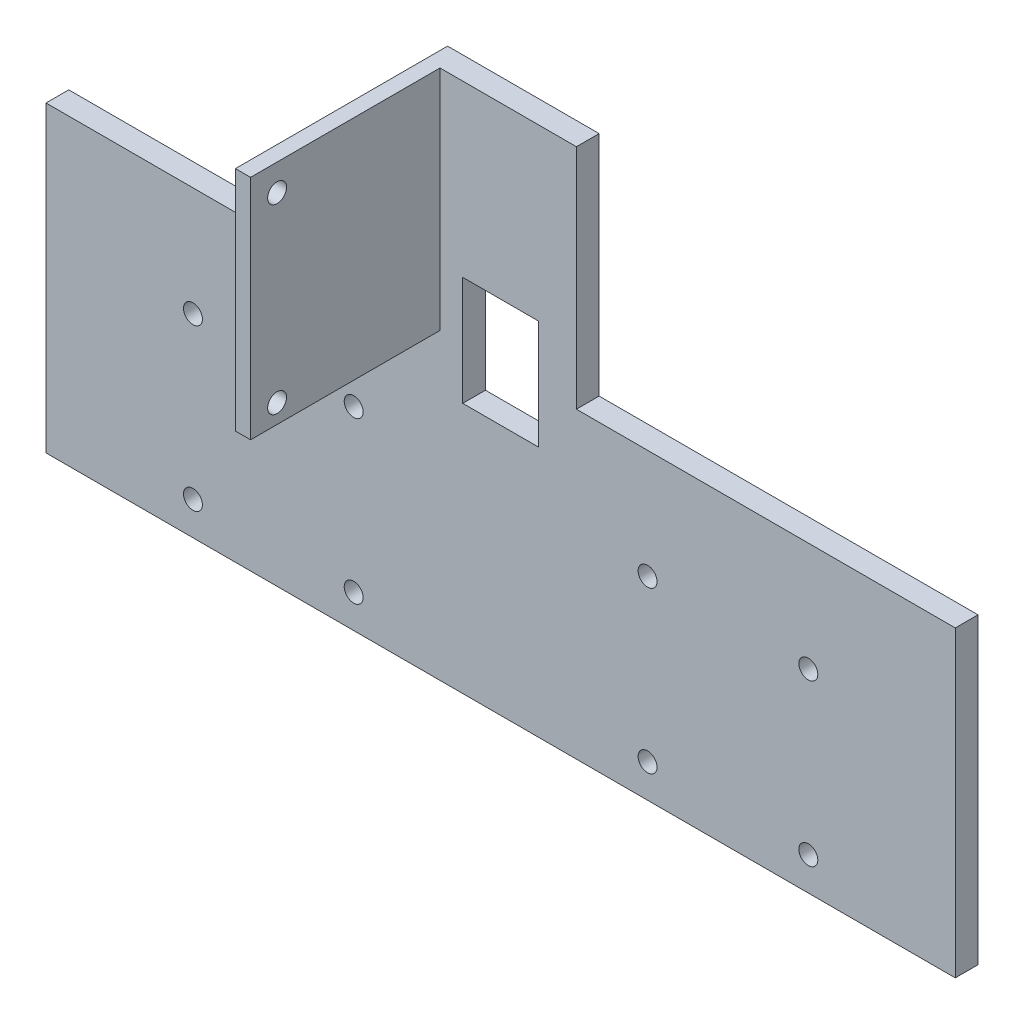
ISO-10303-21;
HEADER;
FILE_DESCRIPTION(('STEP AP214'),'2;1');
FILE_NAME('part.step','',(''),(''),'','','');
FILE_SCHEMA(('AUTOMOTIVE_DESIGN { 1 0 10303 214 1 1 1 1 }'));
ENDSEC;
DATA;
#1=APPLICATION_CONTEXT('core data for automotive mechanical design processes');
#2=APPLICATION_PROTOCOL_DEFINITION('international standard','automotive_design',2000,#1);
#3=PRODUCT_CONTEXT('',#1,'mechanical');
#4=PRODUCT('Part','Part','',(#3));
#5=PRODUCT_RELATED_PRODUCT_CATEGORY('part','',(#4));
#6=PRODUCT_DEFINITION_FORMATION('','',#4);
#7=PRODUCT_DEFINITION_CONTEXT('part definition',#1,'design');
#8=PRODUCT_DEFINITION('design','',#6,#7);
#9=PRODUCT_DEFINITION_SHAPE('','',#8);
#10=(LENGTH_UNIT() NAMED_UNIT(*) SI_UNIT(.MILLI.,.METRE.));
#11=(NAMED_UNIT(*) PLANE_ANGLE_UNIT() SI_UNIT($,.RADIAN.));
#12=(NAMED_UNIT(*) SI_UNIT($,.STERADIAN.) SOLID_ANGLE_UNIT());
#13=UNCERTAINTY_MEASURE_WITH_UNIT(LENGTH_MEASURE(1.E-05),#10,'distance_accuracy_value','');
#14=(GEOMETRIC_REPRESENTATION_CONTEXT(3) GLOBAL_UNCERTAINTY_ASSIGNED_CONTEXT((#13)) GLOBAL_UNIT_ASSIGNED_CONTEXT((#10,
#11,#12)) REPRESENTATION_CONTEXT('',''));
#15=CARTESIAN_POINT('',(0.,0.,0.));
#16=DIRECTION('',(0.,0.,1.));
#17=DIRECTION('',(1.,0.,0.));
#18=AXIS2_PLACEMENT_3D('',#15,#16,#17);
#19=CARTESIAN_POINT('',(-10.,20.,3.));
#20=DIRECTION('',(1.,0.,0.));
#21=DIRECTION('',(0.,0.,-1.));
#22=AXIS2_PLACEMENT_3D('',#19,#20,#21);
#23=PLANE('',#22);
#24=DIRECTION('',(0.,-1.,0.));
#25=VECTOR('',#24,1.);
#26=CARTESIAN_POINT('',(-10.,20.,0.));
#27=LINE('',#26,#25);
#28=CARTESIAN_POINT('',(-10.,50.,0.));
#29=VERTEX_POINT('',#28);
#30=CARTESIAN_POINT('',(-10.,20.,0.));
#31=VERTEX_POINT('',#30);
#32=EDGE_CURVE('E230',#29,#31,#27,.T.);
#33=ORIENTED_EDGE('',*,*,#32,.T.);
#34=DIRECTION('',(0.,0.,-1.));
#35=VECTOR('',#34,1.);
#36=CARTESIAN_POINT('',(-10.,20.,3.));
#37=LINE('',#36,#35);
#38=CARTESIAN_POINT('',(-10.,20.,3.));
#39=VERTEX_POINT('',#38);
#40=EDGE_CURVE('E245',#39,#31,#37,.T.);
#41=ORIENTED_EDGE('',*,*,#40,.F.);
#42=DIRECTION('',(0.,0.,-1.));
#43=VECTOR('',#42,1.);
#44=CARTESIAN_POINT('',(-10.,20.,28.));
#45=LINE('',#44,#43);
#46=CARTESIAN_POINT('',(-10.,20.,28.));
#47=VERTEX_POINT('',#46);
#48=EDGE_CURVE('E201',#47,#39,#45,.T.);
#49=ORIENTED_EDGE('',*,*,#48,.F.);
#50=DIRECTION('',(0.,-1.,0.));
#51=VECTOR('',#50,1.);
#52=CARTESIAN_POINT('',(-10.,50.,28.));
#53=LINE('',#52,#51);
#54=CARTESIAN_POINT('',(-10.,50.,28.));
#55=VERTEX_POINT('',#54);
#56=EDGE_CURVE('E180',#55,#47,#53,.T.);
#57=ORIENTED_EDGE('',*,*,#56,.F.);
#58=DIRECTION('',(0.,0.,-1.));
#59=VECTOR('',#58,1.);
#60=CARTESIAN_POINT('',(-10.,50.,3.));
#61=LINE('',#60,#59);
#62=EDGE_CURVE('E248',#55,#29,#61,.T.);
#63=ORIENTED_EDGE('',*,*,#62,.T.);
#64=EDGE_LOOP('',(#33,#41,#49,#57,#63));
#65=FACE_BOUND('',#64,.T.);
#66=CARTESIAN_POINT('',(-10.,22.499999999999,24.4999999999948));
#67=DIRECTION('',(-1.,0.,0.));
#68=DIRECTION('',(0.,0.,1.));
#69=AXIS2_PLACEMENT_3D('',#66,#67,#68);
#70=CIRCLE('',#69,1.24999999999999);
#71=CARTESIAN_POINT('',(-10.,22.499999999999,25.7499999999947));
#72=VERTEX_POINT('',#71);
#73=EDGE_CURVE('E379',#72,#72,#70,.T.);
#74=ORIENTED_EDGE('',*,*,#73,.F.);
#75=EDGE_LOOP('',(#74));
#76=FACE_BOUND('',#75,.T.);
#77=CARTESIAN_POINT('',(-10.,46.499999999999,24.499999999995));
#78=DIRECTION('',(-1.,0.,0.));
#79=DIRECTION('',(0.,0.,1.));
#80=AXIS2_PLACEMENT_3D('',#77,#78,#79);
#81=CIRCLE('',#80,1.24999999999999);
#82=CARTESIAN_POINT('',(-10.,46.499999999999,25.749999999995));
#83=VERTEX_POINT('',#82);
#84=EDGE_CURVE('E387',#83,#83,#81,.T.);
#85=ORIENTED_EDGE('',*,*,#84,.F.);
#86=EDGE_LOOP('',(#85));
#87=FACE_BOUND('',#86,.T.);
#88=ADVANCED_FACE('F39',(#65,#76,#87),#23,.F.);
#89=CARTESIAN_POINT('',(60.,20.,3.));
#90=DIRECTION('',(-1.,0.,0.));
#91=DIRECTION('',(0.,0.,1.));
#92=AXIS2_PLACEMENT_3D('',#89,#90,#91);
#93=PLANE('',#92);
#94=DIRECTION('',(0.,1.,0.));
#95=VECTOR('',#94,1.);
#96=CARTESIAN_POINT('',(60.,20.,0.));
#97=LINE('',#96,#95);
#98=CARTESIAN_POINT('',(60.,-20.,0.));
#99=VERTEX_POINT('',#98);
#100=CARTESIAN_POINT('',(60.,20.,0.));
#101=VERTEX_POINT('',#100);
#102=EDGE_CURVE('E204',#99,#101,#97,.T.);
#103=ORIENTED_EDGE('',*,*,#102,.T.);
#104=DIRECTION('',(0.,0.,-1.));
#105=VECTOR('',#104,1.);
#106=CARTESIAN_POINT('',(60.,20.,3.));
#107=LINE('',#106,#105);
#108=CARTESIAN_POINT('',(60.,20.,3.));
#109=VERTEX_POINT('',#108);
#110=EDGE_CURVE('E11',#109,#101,#107,.T.);
#111=ORIENTED_EDGE('',*,*,#110,.F.);
#112=DIRECTION('',(0.,1.,0.));
#113=VECTOR('',#112,1.);
#114=CARTESIAN_POINT('',(60.,20.,3.));
#115=LINE('',#114,#113);
#116=CARTESIAN_POINT('',(60.,-20.,3.));
#117=VERTEX_POINT('',#116);
#118=EDGE_CURVE('E205',#117,#109,#115,.T.);
#119=ORIENTED_EDGE('',*,*,#118,.F.);
#120=DIRECTION('',(0.,0.,-1.));
#121=VECTOR('',#120,1.);
#122=CARTESIAN_POINT('',(60.,-20.,3.));
#123=LINE('',#122,#121);
#124=EDGE_CURVE('E221',#117,#99,#123,.T.);
#125=ORIENTED_EDGE('',*,*,#124,.T.);
#126=EDGE_LOOP('',(#103,#111,#119,#125));
#127=FACE_BOUND('',#126,.T.);
#128=ADVANCED_FACE('F41',(#127),#93,.F.);
#129=CARTESIAN_POINT('',(60.,20.,3.));
#130=DIRECTION('',(0.,-1.,0.));
#131=DIRECTION('',(1.,0.,0.));
#132=AXIS2_PLACEMENT_3D('',#129,#130,#131);
#133=PLANE('',#132);
#134=DIRECTION('',(-1.,0.,0.));
#135=VECTOR('',#134,1.);
#136=CARTESIAN_POINT('',(60.,20.,0.));
#137=LINE('',#136,#135);
#138=CARTESIAN_POINT('',(10.,20.,0.));
#139=VERTEX_POINT('',#138);
#140=EDGE_CURVE('E224',#101,#139,#137,.T.);
#141=ORIENTED_EDGE('',*,*,#140,.T.);
#142=DIRECTION('',(0.,0.,-1.));
#143=VECTOR('',#142,1.);
#144=CARTESIAN_POINT('',(10.,20.,3.));
#145=LINE('',#144,#143);
#146=CARTESIAN_POINT('',(10.,20.,3.));
#147=VERTEX_POINT('',#146);
#148=EDGE_CURVE('E47',#147,#139,#145,.T.);
#149=ORIENTED_EDGE('',*,*,#148,.F.);
#150=DIRECTION('',(-1.,0.,0.));
#151=VECTOR('',#150,1.);
#152=CARTESIAN_POINT('',(60.,20.,3.));
#153=LINE('',#152,#151);
#154=EDGE_CURVE('E208',#109,#147,#153,.T.);
#155=ORIENTED_EDGE('',*,*,#154,.F.);
#156=ORIENTED_EDGE('',*,*,#110,.T.);
#157=EDGE_LOOP('',(#141,#149,#155,#156));
#158=FACE_BOUND('',#157,.T.);
#159=ADVANCED_FACE('F301',(#158),#133,.F.);
#160=CARTESIAN_POINT('',(9.99999999999999,50.,3.));
#161=DIRECTION('',(-1.,0.,0.));
#162=DIRECTION('',(0.,-1.,0.));
#163=AXIS2_PLACEMENT_3D('',#160,#161,#162);
#164=PLANE('',#163);
#165=DIRECTION('',(0.,1.,0.));
#166=VECTOR('',#165,1.);
#167=CARTESIAN_POINT('',(9.99999999999999,50.,0.));
#168=LINE('',#167,#166);
#169=CARTESIAN_POINT('',(9.99999999999999,50.,0.));
#170=VERTEX_POINT('',#169);
#171=EDGE_CURVE('E226',#139,#170,#168,.T.);
#172=ORIENTED_EDGE('',*,*,#171,.T.);
#173=DIRECTION('',(0.,0.,-1.));
#174=VECTOR('',#173,1.);
#175=CARTESIAN_POINT('',(9.99999999999999,50.,3.));
#176=LINE('',#175,#174);
#177=CARTESIAN_POINT('',(9.99999999999999,50.,3.));
#178=VERTEX_POINT('',#177);
#179=EDGE_CURVE('E251',#178,#170,#176,.T.);
#180=ORIENTED_EDGE('',*,*,#179,.F.);
#181=DIRECTION('',(0.,1.,0.));
#182=VECTOR('',#181,1.);
#183=CARTESIAN_POINT('',(9.99999999999999,50.,3.));
#184=LINE('',#183,#182);
#185=EDGE_CURVE('E211',#147,#178,#184,.T.);
#186=ORIENTED_EDGE('',*,*,#185,.F.);
#187=ORIENTED_EDGE('',*,*,#148,.T.);
#188=EDGE_LOOP('',(#172,#180,#186,#187));
#189=FACE_BOUND('',#188,.T.);
#190=ADVANCED_FACE('F258',(#189),#164,.F.);
#191=CARTESIAN_POINT('',(-10.,50.,3.));
#192=DIRECTION('',(0.,-1.,0.));
#193=DIRECTION('',(0.,0.,-1.));
#194=AXIS2_PLACEMENT_3D('',#191,#192,#193);
#195=PLANE('',#194);
#196=DIRECTION('',(-1.,0.,0.));
#197=VECTOR('',#196,1.);
#198=CARTESIAN_POINT('',(-10.,50.,0.));
#199=LINE('',#198,#197);
#200=EDGE_CURVE('E228',#170,#29,#199,.T.);
#201=ORIENTED_EDGE('',*,*,#200,.T.);
#202=ORIENTED_EDGE('',*,*,#62,.F.);
#203=DIRECTION('',(-1.,0.,0.));
#204=VECTOR('',#203,1.);
#205=CARTESIAN_POINT('',(-10.,50.,28.));
#206=LINE('',#205,#204);
#207=CARTESIAN_POINT('',(-8.00000000000001,50.,28.));
#208=VERTEX_POINT('',#207);
#209=EDGE_CURVE('E188',#208,#55,#206,.T.);
#210=ORIENTED_EDGE('',*,*,#209,.F.);
#211=DIRECTION('',(0.,0.,-1.));
#212=VECTOR('',#211,1.);
#213=CARTESIAN_POINT('',(-8.00000000000001,50.,28.));
#214=LINE('',#213,#212);
#215=CARTESIAN_POINT('',(-8.,50.,3.));
#216=VERTEX_POINT('',#215);
#217=EDGE_CURVE('E191',#208,#216,#214,.T.);
#218=ORIENTED_EDGE('',*,*,#217,.T.);
#219=DIRECTION('',(-1.,0.,0.));
#220=VECTOR('',#219,1.);
#221=CARTESIAN_POINT('',(-10.,50.,3.));
#222=LINE('',#221,#220);
#223=EDGE_CURVE('E213',#178,#216,#222,.T.);
#224=ORIENTED_EDGE('',*,*,#223,.F.);
#225=ORIENTED_EDGE('',*,*,#179,.T.);
#226=EDGE_LOOP('',(#201,#202,#210,#218,#224,#225));
#227=FACE_BOUND('',#226,.T.);
#228=ADVANCED_FACE('F266',(#227),#195,.F.);
#229=CARTESIAN_POINT('',(-60.,20.,3.));
#230=DIRECTION('',(0.,-1.,0.));
#231=DIRECTION('',(0.,0.,-1.));
#232=AXIS2_PLACEMENT_3D('',#229,#230,#231);
#233=PLANE('',#232);
#234=DIRECTION('',(-1.,0.,0.));
#235=VECTOR('',#234,1.);
#236=CARTESIAN_POINT('',(-60.,20.,0.));
#237=LINE('',#236,#235);
#238=CARTESIAN_POINT('',(-60.,20.,0.));
#239=VERTEX_POINT('',#238);
#240=EDGE_CURVE('E232',#31,#239,#237,.T.);
#241=ORIENTED_EDGE('',*,*,#240,.T.);
#242=DIRECTION('',(0.,0.,-1.));
#243=VECTOR('',#242,1.);
#244=CARTESIAN_POINT('',(-60.,20.,3.));
#245=LINE('',#244,#243);
#246=CARTESIAN_POINT('',(-60.,20.,3.));
#247=VERTEX_POINT('',#246);
#248=EDGE_CURVE('E242',#247,#239,#245,.T.);
#249=ORIENTED_EDGE('',*,*,#248,.F.);
#250=DIRECTION('',(-1.,0.,0.));
#251=VECTOR('',#250,1.);
#252=CARTESIAN_POINT('',(-60.,20.,3.));
#253=LINE('',#252,#251);
#254=EDGE_CURVE('E215',#39,#247,#253,.T.);
#255=ORIENTED_EDGE('',*,*,#254,.F.);
#256=ORIENTED_EDGE('',*,*,#40,.T.);
#257=EDGE_LOOP('',(#241,#249,#255,#256));
#258=FACE_BOUND('',#257,.T.);
#259=ADVANCED_FACE('F305',(#258),#233,.F.);
#260=CARTESIAN_POINT('',(-60.,20.,3.));
#261=DIRECTION('',(1.,0.,0.));
#262=DIRECTION('',(0.,1.,0.));
#263=AXIS2_PLACEMENT_3D('',#260,#261,#262);
#264=PLANE('',#263);
#265=DIRECTION('',(0.,-1.,0.));
#266=VECTOR('',#265,1.);
#267=CARTESIAN_POINT('',(-60.,20.,0.));
#268=LINE('',#267,#266);
#269=CARTESIAN_POINT('',(-60.,-20.,0.));
#270=VERTEX_POINT('',#269);
#271=EDGE_CURVE('E234',#239,#270,#268,.T.);
#272=ORIENTED_EDGE('',*,*,#271,.T.);
#273=DIRECTION('',(0.,0.,-1.));
#274=VECTOR('',#273,1.);
#275=CARTESIAN_POINT('',(-60.,-20.,3.));
#276=LINE('',#275,#274);
#277=CARTESIAN_POINT('',(-60.,-20.,3.));
#278=VERTEX_POINT('',#277);
#279=EDGE_CURVE('E239',#278,#270,#276,.T.);
#280=ORIENTED_EDGE('',*,*,#279,.F.);
#281=DIRECTION('',(0.,-1.,0.));
#282=VECTOR('',#281,1.);
#283=CARTESIAN_POINT('',(-60.,20.,3.));
#284=LINE('',#283,#282);
#285=EDGE_CURVE('E217',#247,#278,#284,.T.);
#286=ORIENTED_EDGE('',*,*,#285,.F.);
#287=ORIENTED_EDGE('',*,*,#248,.T.);
#288=EDGE_LOOP('',(#272,#280,#286,#287));
#289=FACE_BOUND('',#288,.T.);
#290=ADVANCED_FACE('F324',(#289),#264,.F.);
#291=CARTESIAN_POINT('',(-60.,-20.,3.));
#292=DIRECTION('',(0.,1.,0.));
#293=DIRECTION('',(-1.,0.,0.));
#294=AXIS2_PLACEMENT_3D('',#291,#292,#293);
#295=PLANE('',#294);
#296=DIRECTION('',(1.,0.,0.));
#297=VECTOR('',#296,1.);
#298=CARTESIAN_POINT('',(-60.,-20.,0.));
#299=LINE('',#298,#297);
#300=EDGE_CURVE('E209',#270,#99,#299,.T.);
#301=ORIENTED_EDGE('',*,*,#300,.T.);
#302=ORIENTED_EDGE('',*,*,#124,.F.);
#303=DIRECTION('',(1.,0.,0.));
#304=VECTOR('',#303,1.);
#305=CARTESIAN_POINT('',(-60.,-20.,3.));
#306=LINE('',#305,#304);
#307=EDGE_CURVE('E219',#278,#117,#306,.T.);
#308=ORIENTED_EDGE('',*,*,#307,.F.);
#309=ORIENTED_EDGE('',*,*,#279,.T.);
#310=EDGE_LOOP('',(#301,#302,#308,#309));
#311=FACE_BOUND('',#310,.T.);
#312=ADVANCED_FACE('F319',(#311),#295,.F.);
#313=CARTESIAN_POINT('',(0.,0.,3.));
#314=DIRECTION('',(0.,0.,1.));
#315=DIRECTION('',(1.,0.,0.));
#316=AXIS2_PLACEMENT_3D('',#313,#314,#315);
#317=PLANE('',#316);
#318=CARTESIAN_POINT('',(-40.6066017177982,5.60660171779826,3.));
#319=DIRECTION('',(0.,0.,1.));
#320=DIRECTION('',(1.,0.,0.));
#321=AXIS2_PLACEMENT_3D('',#318,#319,#320);
#322=CIRCLE('',#321,1.24999999999999);
#323=CARTESIAN_POINT('',(-39.3566017177982,5.60660171779826,3.));
#324=VERTEX_POINT('',#323);
#325=EDGE_CURVE('E343',#324,#324,#322,.T.);
#326=ORIENTED_EDGE('',*,*,#325,.F.);
#327=EDGE_LOOP('',(#326));
#328=FACE_BOUND('',#327,.T.);
#329=CARTESIAN_POINT('',(-19.3933982822018,5.60660171779824,3.));
#330=DIRECTION('',(0.,0.,1.));
#331=DIRECTION('',(1.,0.,0.));
#332=AXIS2_PLACEMENT_3D('',#329,#330,#331);
#333=CIRCLE('',#332,1.24999999999999);
#334=CARTESIAN_POINT('',(-18.1433982822018,5.60660171779824,3.));
#335=VERTEX_POINT('',#334);
#336=EDGE_CURVE('E347',#335,#335,#333,.T.);
#337=ORIENTED_EDGE('',*,*,#336,.F.);
#338=EDGE_LOOP('',(#337));
#339=FACE_BOUND('',#338,.T.);
#340=CARTESIAN_POINT('',(-19.3933982822018,-15.6066017177982,3.));
#341=DIRECTION('',(0.,0.,1.));
#342=DIRECTION('',(1.,0.,0.));
#343=AXIS2_PLACEMENT_3D('',#340,#341,#342);
#344=CIRCLE('',#343,1.24999999999999);
#345=CARTESIAN_POINT('',(-18.1433982822018,-15.6066017177982,3.));
#346=VERTEX_POINT('',#345);
#347=EDGE_CURVE('E351',#346,#346,#344,.T.);
#348=ORIENTED_EDGE('',*,*,#347,.F.);
#349=EDGE_LOOP('',(#348));
#350=FACE_BOUND('',#349,.T.);
#351=CARTESIAN_POINT('',(-40.6066017177982,-15.6066017177981,3.));
#352=DIRECTION('',(0.,0.,1.));
#353=DIRECTION('',(1.,0.,0.));
#354=AXIS2_PLACEMENT_3D('',#351,#352,#353);
#355=CIRCLE('',#354,1.24999999999999);
#356=CARTESIAN_POINT('',(-39.3566017177983,-15.6066017177981,3.));
#357=VERTEX_POINT('',#356);
#358=EDGE_CURVE('E355',#357,#357,#355,.T.);
#359=ORIENTED_EDGE('',*,*,#358,.F.);
#360=EDGE_LOOP('',(#359));
#361=FACE_BOUND('',#360,.T.);
#362=CARTESIAN_POINT('',(19.3933982822018,5.60660171779821,3.));
#363=DIRECTION('',(0.,0.,1.));
#364=DIRECTION('',(1.,0.,0.));
#365=AXIS2_PLACEMENT_3D('',#362,#363,#364);
#366=CIRCLE('',#365,1.24999999999999);
#367=CARTESIAN_POINT('',(20.6433982822018,5.60660171779821,3.));
#368=VERTEX_POINT('',#367);
#369=EDGE_CURVE('E359',#368,#368,#366,.T.);
#370=ORIENTED_EDGE('',*,*,#369,.F.);
#371=EDGE_LOOP('',(#370));
#372=FACE_BOUND('',#371,.T.);
#373=CARTESIAN_POINT('',(40.6066017177982,5.6066017177982,3.));
#374=DIRECTION('',(0.,0.,1.));
#375=DIRECTION('',(1.,0.,0.));
#376=AXIS2_PLACEMENT_3D('',#373,#374,#375);
#377=CIRCLE('',#376,1.24999999999999);
#378=CARTESIAN_POINT('',(41.8566017177982,5.6066017177982,3.));
#379=VERTEX_POINT('',#378);
#380=EDGE_CURVE('E363',#379,#379,#377,.T.);
#381=ORIENTED_EDGE('',*,*,#380,.F.);
#382=EDGE_LOOP('',(#381));
#383=FACE_BOUND('',#382,.T.);
#384=CARTESIAN_POINT('',(19.3933982822018,-15.6066017177982,3.));
#385=DIRECTION('',(0.,0.,1.));
#386=DIRECTION('',(1.,0.,0.));
#387=AXIS2_PLACEMENT_3D('',#384,#385,#386);
#388=CIRCLE('',#387,1.24999999999999);
#389=CARTESIAN_POINT('',(20.6433982822018,-15.6066017177982,3.));
#390=VERTEX_POINT('',#389);
#391=EDGE_CURVE('E367',#390,#390,#388,.T.);
#392=ORIENTED_EDGE('',*,*,#391,.F.);
#393=EDGE_LOOP('',(#392));
#394=FACE_BOUND('',#393,.T.);
#395=CARTESIAN_POINT('',(40.6066017177982,-15.6066017177982,3.));
#396=DIRECTION('',(0.,0.,1.));
#397=DIRECTION('',(1.,0.,0.));
#398=AXIS2_PLACEMENT_3D('',#395,#396,#397);
#399=CIRCLE('',#398,1.24999999999999);
#400=CARTESIAN_POINT('',(41.8566017177982,-15.6066017177982,3.));
#401=VERTEX_POINT('',#400);
#402=EDGE_CURVE('E371',#401,#401,#399,.T.);
#403=ORIENTED_EDGE('',*,*,#402,.F.);
#404=EDGE_LOOP('',(#403));
#405=FACE_BOUND('',#404,.T.);
#406=DIRECTION('',(-1.,0.,0.));
#407=VECTOR('',#406,1.);
#408=CARTESIAN_POINT('',(5.00000000000001,27.5704968386226,3.));
#409=LINE('',#408,#407);
#410=CARTESIAN_POINT('',(5.00000000000001,27.5704968386226,3.));
#411=VERTEX_POINT('',#410);
#412=CARTESIAN_POINT('',(-5.,27.5704968386226,3.));
#413=VERTEX_POINT('',#412);
#414=EDGE_CURVE('E54',#411,#413,#409,.T.);
#415=ORIENTED_EDGE('',*,*,#414,.F.);
#416=DIRECTION('',(0.,1.,0.));
#417=VECTOR('',#416,1.);
#418=CARTESIAN_POINT('',(5.00000000000001,13.1681185511554,3.));
#419=LINE('',#418,#417);
#420=CARTESIAN_POINT('',(5.00000000000001,13.1681185511554,3.));
#421=VERTEX_POINT('',#420);
#422=EDGE_CURVE('E151',#421,#411,#419,.T.);
#423=ORIENTED_EDGE('',*,*,#422,.F.);
#424=DIRECTION('',(1.,0.,0.));
#425=VECTOR('',#424,1.);
#426=CARTESIAN_POINT('',(-5.,13.1681185511554,3.));
#427=LINE('',#426,#425);
#428=CARTESIAN_POINT('',(-5.,13.1681185511554,3.));
#429=VERTEX_POINT('',#428);
#430=EDGE_CURVE('E171',#429,#421,#427,.T.);
#431=ORIENTED_EDGE('',*,*,#430,.F.);
#432=DIRECTION('',(0.,-1.,0.));
#433=VECTOR('',#432,1.);
#434=CARTESIAN_POINT('',(-5.,27.5704968386226,3.));
#435=LINE('',#434,#433);
#436=EDGE_CURVE('E165',#413,#429,#435,.T.);
#437=ORIENTED_EDGE('',*,*,#436,.F.);
#438=EDGE_LOOP('',(#415,#423,#431,#437));
#439=FACE_BOUND('',#438,.T.);
#440=DIRECTION('',(0.,1.,0.));
#441=VECTOR('',#440,1.);
#442=CARTESIAN_POINT('',(-8.00000000000001,50.,3.));
#443=LINE('',#442,#441);
#444=CARTESIAN_POINT('',(-8.,20.,3.));
#445=VERTEX_POINT('',#444);
#446=EDGE_CURVE('E184',#445,#216,#443,.T.);
#447=ORIENTED_EDGE('',*,*,#446,.F.);
#448=DIRECTION('',(1.,0.,0.));
#449=VECTOR('',#448,1.);
#450=CARTESIAN_POINT('',(-10.,20.,3.));
#451=LINE('',#450,#449);
#452=EDGE_CURVE('E157',#39,#445,#451,.T.);
#453=ORIENTED_EDGE('',*,*,#452,.F.);
#454=ORIENTED_EDGE('',*,*,#254,.T.);
#455=ORIENTED_EDGE('',*,*,#285,.T.);
#456=ORIENTED_EDGE('',*,*,#307,.T.);
#457=ORIENTED_EDGE('',*,*,#118,.T.);
#458=ORIENTED_EDGE('',*,*,#154,.T.);
#459=ORIENTED_EDGE('',*,*,#185,.T.);
#460=ORIENTED_EDGE('',*,*,#223,.T.);
#461=EDGE_LOOP('',(#447,#453,#454,#455,#456,#457,#458,#459,#460));
#462=FACE_BOUND('',#461,.T.);
#463=ADVANCED_FACE('F282',(#328,#339,#350,#361,#372,#383,#394,#405,#439,#462),#317,.T.);
#464=CARTESIAN_POINT('',(0.,0.,0.));
#465=DIRECTION('',(0.,0.,1.));
#466=DIRECTION('',(1.,0.,0.));
#467=AXIS2_PLACEMENT_3D('',#464,#465,#466);
#468=PLANE('',#467);
#469=CARTESIAN_POINT('',(-40.6066017177982,5.60660171779826,0.));
#470=DIRECTION('',(0.,0.,1.));
#471=DIRECTION('',(1.,0.,0.));
#472=AXIS2_PLACEMENT_3D('',#469,#470,#471);
#473=CIRCLE('',#472,1.24999999999999);
#474=CARTESIAN_POINT('',(-39.3566017177982,5.60660171779826,0.));
#475=VERTEX_POINT('',#474);
#476=EDGE_CURVE('E418',#475,#475,#473,.T.);
#477=ORIENTED_EDGE('',*,*,#476,.T.);
#478=EDGE_LOOP('',(#477));
#479=FACE_BOUND('',#478,.T.);
#480=CARTESIAN_POINT('',(-19.3933982822018,5.60660171779824,0.));
#481=DIRECTION('',(0.,0.,1.));
#482=DIRECTION('',(1.,0.,0.));
#483=AXIS2_PLACEMENT_3D('',#480,#481,#482);
#484=CIRCLE('',#483,1.24999999999999);
#485=CARTESIAN_POINT('',(-18.1433982822018,5.60660171779824,0.));
#486=VERTEX_POINT('',#485);
#487=EDGE_CURVE('E414',#486,#486,#484,.T.);
#488=ORIENTED_EDGE('',*,*,#487,.T.);
#489=EDGE_LOOP('',(#488));
#490=FACE_BOUND('',#489,.T.);
#491=CARTESIAN_POINT('',(-19.3933982822018,-15.6066017177982,0.));
#492=DIRECTION('',(0.,0.,1.));
#493=DIRECTION('',(1.,0.,0.));
#494=AXIS2_PLACEMENT_3D('',#491,#492,#493);
#495=CIRCLE('',#494,1.24999999999999);
#496=CARTESIAN_POINT('',(-18.1433982822018,-15.6066017177982,0.));
#497=VERTEX_POINT('',#496);
#498=EDGE_CURVE('E410',#497,#497,#495,.T.);
#499=ORIENTED_EDGE('',*,*,#498,.T.);
#500=EDGE_LOOP('',(#499));
#501=FACE_BOUND('',#500,.T.);
#502=CARTESIAN_POINT('',(-40.6066017177982,-15.6066017177981,0.));
#503=DIRECTION('',(0.,0.,1.));
#504=DIRECTION('',(1.,0.,0.));
#505=AXIS2_PLACEMENT_3D('',#502,#503,#504);
#506=CIRCLE('',#505,1.24999999999999);
#507=CARTESIAN_POINT('',(-39.3566017177982,-15.6066017177981,0.));
#508=VERTEX_POINT('',#507);
#509=EDGE_CURVE('E406',#508,#508,#506,.T.);
#510=ORIENTED_EDGE('',*,*,#509,.T.);
#511=EDGE_LOOP('',(#510));
#512=FACE_BOUND('',#511,.T.);
#513=CARTESIAN_POINT('',(19.3933982822018,5.60660171779821,0.));
#514=DIRECTION('',(0.,0.,1.));
#515=DIRECTION('',(1.,0.,0.));
#516=AXIS2_PLACEMENT_3D('',#513,#514,#515);
#517=CIRCLE('',#516,1.24999999999999);
#518=CARTESIAN_POINT('',(20.6433982822018,5.60660171779821,0.));
#519=VERTEX_POINT('',#518);
#520=EDGE_CURVE('E402',#519,#519,#517,.T.);
#521=ORIENTED_EDGE('',*,*,#520,.T.);
#522=EDGE_LOOP('',(#521));
#523=FACE_BOUND('',#522,.T.);
#524=CARTESIAN_POINT('',(40.6066017177982,5.6066017177982,0.));
#525=DIRECTION('',(0.,0.,1.));
#526=DIRECTION('',(1.,0.,0.));
#527=AXIS2_PLACEMENT_3D('',#524,#525,#526);
#528=CIRCLE('',#527,1.24999999999999);
#529=CARTESIAN_POINT('',(41.8566017177982,5.6066017177982,0.));
#530=VERTEX_POINT('',#529);
#531=EDGE_CURVE('E398',#530,#530,#528,.T.);
#532=ORIENTED_EDGE('',*,*,#531,.T.);
#533=EDGE_LOOP('',(#532));
#534=FACE_BOUND('',#533,.T.);
#535=CARTESIAN_POINT('',(19.3933982822018,-15.6066017177982,0.));
#536=DIRECTION('',(0.,0.,1.));
#537=DIRECTION('',(1.,0.,0.));
#538=AXIS2_PLACEMENT_3D('',#535,#536,#537);
#539=CIRCLE('',#538,1.24999999999999);
#540=CARTESIAN_POINT('',(20.6433982822018,-15.6066017177982,0.));
#541=VERTEX_POINT('',#540);
#542=EDGE_CURVE('E394',#541,#541,#539,.T.);
#543=ORIENTED_EDGE('',*,*,#542,.T.);
#544=EDGE_LOOP('',(#543));
#545=FACE_BOUND('',#544,.T.);
#546=CARTESIAN_POINT('',(40.6066017177982,-15.6066017177982,0.));
#547=DIRECTION('',(0.,0.,1.));
#548=DIRECTION('',(1.,0.,0.));
#549=AXIS2_PLACEMENT_3D('',#546,#547,#548);
#550=CIRCLE('',#549,1.24999999999999);
#551=CARTESIAN_POINT('',(41.8566017177982,-15.6066017177982,0.));
#552=VERTEX_POINT('',#551);
#553=EDGE_CURVE('E390',#552,#552,#550,.T.);
#554=ORIENTED_EDGE('',*,*,#553,.T.);
#555=EDGE_LOOP('',(#554));
#556=FACE_BOUND('',#555,.T.);
#557=DIRECTION('',(0.,-1.,0.));
#558=VECTOR('',#557,1.);
#559=CARTESIAN_POINT('',(5.00000000000001,13.1681185511554,0.));
#560=LINE('',#559,#558);
#561=CARTESIAN_POINT('',(5.00000000000001,27.5704968386226,0.));
#562=VERTEX_POINT('',#561);
#563=CARTESIAN_POINT('',(5.00000000000001,13.1681185511554,0.));
#564=VERTEX_POINT('',#563);
#565=EDGE_CURVE('E163',#562,#564,#560,.T.);
#566=ORIENTED_EDGE('',*,*,#565,.F.);
#567=DIRECTION('',(1.,0.,0.));
#568=VECTOR('',#567,1.);
#569=CARTESIAN_POINT('',(5.00000000000001,27.5704968386226,0.));
#570=LINE('',#569,#568);
#571=CARTESIAN_POINT('',(-5.,27.5704968386226,0.));
#572=VERTEX_POINT('',#571);
#573=EDGE_CURVE('E145',#572,#562,#570,.T.);
#574=ORIENTED_EDGE('',*,*,#573,.F.);
#575=DIRECTION('',(0.,1.,0.));
#576=VECTOR('',#575,1.);
#577=CARTESIAN_POINT('',(-5.,27.5704968386226,0.));
#578=LINE('',#577,#576);
#579=CARTESIAN_POINT('',(-5.,13.1681185511554,0.));
#580=VERTEX_POINT('',#579);
#581=EDGE_CURVE('E154',#580,#572,#578,.T.);
#582=ORIENTED_EDGE('',*,*,#581,.F.);
#583=DIRECTION('',(-1.,0.,0.));
#584=VECTOR('',#583,1.);
#585=CARTESIAN_POINT('',(-5.,13.1681185511554,0.));
#586=LINE('',#585,#584);
#587=EDGE_CURVE('E62',#564,#580,#586,.T.);
#588=ORIENTED_EDGE('',*,*,#587,.F.);
#589=EDGE_LOOP('',(#566,#574,#582,#588));
#590=FACE_BOUND('',#589,.T.);
#591=ORIENTED_EDGE('',*,*,#102,.F.);
#592=ORIENTED_EDGE('',*,*,#300,.F.);
#593=ORIENTED_EDGE('',*,*,#271,.F.);
#594=ORIENTED_EDGE('',*,*,#240,.F.);
#595=ORIENTED_EDGE('',*,*,#32,.F.);
#596=ORIENTED_EDGE('',*,*,#200,.F.);
#597=ORIENTED_EDGE('',*,*,#171,.F.);
#598=ORIENTED_EDGE('',*,*,#140,.F.);
#599=EDGE_LOOP('',(#591,#592,#593,#594,#595,#596,#597,#598));
#600=FACE_BOUND('',#599,.T.);
#601=ADVANCED_FACE('F160',(#479,#490,#501,#512,#523,#534,#545,#556,#590,#600),#468,.F.);
#602=CARTESIAN_POINT('',(-10.,20.,28.));
#603=DIRECTION('',(0.,1.,0.));
#604=DIRECTION('',(0.,0.,1.));
#605=AXIS2_PLACEMENT_3D('',#602,#603,#604);
#606=PLANE('',#605);
#607=ORIENTED_EDGE('',*,*,#452,.T.);
#608=DIRECTION('',(0.,0.,-1.));
#609=VECTOR('',#608,1.);
#610=CARTESIAN_POINT('',(-8.,20.,28.));
#611=LINE('',#610,#609);
#612=CARTESIAN_POINT('',(-8.,20.,28.));
#613=VERTEX_POINT('',#612);
#614=EDGE_CURVE('E198',#613,#445,#611,.T.);
#615=ORIENTED_EDGE('',*,*,#614,.F.);
#616=DIRECTION('',(1.,0.,0.));
#617=VECTOR('',#616,1.);
#618=CARTESIAN_POINT('',(-10.,20.,28.));
#619=LINE('',#618,#617);
#620=EDGE_CURVE('E183',#47,#613,#619,.T.);
#621=ORIENTED_EDGE('',*,*,#620,.F.);
#622=ORIENTED_EDGE('',*,*,#48,.T.);
#623=EDGE_LOOP('',(#607,#615,#621,#622));
#624=FACE_BOUND('',#623,.T.);
#625=ADVANCED_FACE('F284',(#624),#606,.F.);
#626=CARTESIAN_POINT('',(-8.00000000000001,50.,28.));
#627=DIRECTION('',(-1.,0.,0.));
#628=DIRECTION('',(0.,-1.,0.));
#629=AXIS2_PLACEMENT_3D('',#626,#627,#628);
#630=PLANE('',#629);
#631=CARTESIAN_POINT('',(-8.00000000000001,46.499999999999,24.499999999995));
#632=DIRECTION('',(-1.,0.,0.));
#633=DIRECTION('',(0.,-1.,0.));
#634=AXIS2_PLACEMENT_3D('',#631,#632,#633);
#635=CIRCLE('',#634,1.24999999999999);
#636=CARTESIAN_POINT('',(-8.00000000000001,45.249999999999,24.499999999995));
#637=VERTEX_POINT('',#636);
#638=EDGE_CURVE('E384',#637,#637,#635,.T.);
#639=ORIENTED_EDGE('',*,*,#638,.T.);
#640=EDGE_LOOP('',(#639));
#641=FACE_BOUND('',#640,.T.);
#642=CARTESIAN_POINT('',(-8.,22.499999999999,24.4999999999948));
#643=DIRECTION('',(-1.,0.,0.));
#644=DIRECTION('',(0.,-1.,0.));
#645=AXIS2_PLACEMENT_3D('',#642,#643,#644);
#646=CIRCLE('',#645,1.24999999999999);
#647=CARTESIAN_POINT('',(-8.,21.249999999999,24.4999999999948));
#648=VERTEX_POINT('',#647);
#649=EDGE_CURVE('E377',#648,#648,#646,.T.);
#650=ORIENTED_EDGE('',*,*,#649,.T.);
#651=EDGE_LOOP('',(#650));
#652=FACE_BOUND('',#651,.T.);
#653=ORIENTED_EDGE('',*,*,#446,.T.);
#654=ORIENTED_EDGE('',*,*,#217,.F.);
#655=DIRECTION('',(0.,1.,0.));
#656=VECTOR('',#655,1.);
#657=CARTESIAN_POINT('',(-8.00000000000001,50.,28.));
#658=LINE('',#657,#656);
#659=EDGE_CURVE('E186',#613,#208,#658,.T.);
#660=ORIENTED_EDGE('',*,*,#659,.F.);
#661=ORIENTED_EDGE('',*,*,#614,.T.);
#662=EDGE_LOOP('',(#653,#654,#660,#661));
#663=FACE_BOUND('',#662,.T.);
#664=ADVANCED_FACE('F280',(#641,#652,#663),#630,.F.);
#665=CARTESIAN_POINT('',(0.,0.,28.));
#666=DIRECTION('',(0.,0.,1.));
#667=DIRECTION('',(1.,0.,0.));
#668=AXIS2_PLACEMENT_3D('',#665,#666,#667);
#669=PLANE('',#668);
#670=ORIENTED_EDGE('',*,*,#56,.T.);
#671=ORIENTED_EDGE('',*,*,#620,.T.);
#672=ORIENTED_EDGE('',*,*,#659,.T.);
#673=ORIENTED_EDGE('',*,*,#209,.T.);
#674=EDGE_LOOP('',(#670,#671,#672,#673));
#675=FACE_BOUND('',#674,.T.);
#676=ADVANCED_FACE('F275',(#675),#669,.T.);
#677=CARTESIAN_POINT('',(5.00000000000001,27.5704968386226,-0.00100000000000013));
#678=DIRECTION('',(0.,1.,0.));
#679=DIRECTION('',(0.,0.,1.));
#680=AXIS2_PLACEMENT_3D('',#677,#678,#679);
#681=PLANE('',#680);
#682=ORIENTED_EDGE('',*,*,#573,.T.);
#683=DIRECTION('',(0.,0.,1.));
#684=VECTOR('',#683,1.);
#685=CARTESIAN_POINT('',(5.00000000000001,27.5704968386226,-0.00100000000000013));
#686=LINE('',#685,#684);
#687=EDGE_CURVE('E158',#562,#411,#686,.T.);
#688=ORIENTED_EDGE('',*,*,#687,.T.);
#689=ORIENTED_EDGE('',*,*,#414,.T.);
#690=DIRECTION('',(0.,0.,1.));
#691=VECTOR('',#690,1.);
#692=CARTESIAN_POINT('',(-5.,27.5704968386226,-0.00100000000000013));
#693=LINE('',#692,#691);
#694=EDGE_CURVE('E141',#572,#413,#693,.T.);
#695=ORIENTED_EDGE('',*,*,#694,.F.);
#696=EDGE_LOOP('',(#682,#688,#689,#695));
#697=FACE_BOUND('',#696,.T.);
#698=ADVANCED_FACE('F143',(#697),#681,.F.);
#699=CARTESIAN_POINT('',(5.00000000000001,13.1681185511554,-0.00100000000000013));
#700=DIRECTION('',(1.,0.,0.));
#701=DIRECTION('',(0.,0.,-1.));
#702=AXIS2_PLACEMENT_3D('',#699,#700,#701);
#703=PLANE('',#702);
#704=ORIENTED_EDGE('',*,*,#565,.T.);
#705=DIRECTION('',(0.,0.,1.));
#706=VECTOR('',#705,1.);
#707=CARTESIAN_POINT('',(5.00000000000001,13.1681185511554,-0.00100000000000013));
#708=LINE('',#707,#706);
#709=EDGE_CURVE('E177',#564,#421,#708,.T.);
#710=ORIENTED_EDGE('',*,*,#709,.T.);
#711=ORIENTED_EDGE('',*,*,#422,.T.);
#712=ORIENTED_EDGE('',*,*,#687,.F.);
#713=EDGE_LOOP('',(#704,#710,#711,#712));
#714=FACE_BOUND('',#713,.T.);
#715=ADVANCED_FACE('F376',(#714),#703,.F.);
#716=CARTESIAN_POINT('',(-5.,13.1681185511554,-0.00100000000000013));
#717=DIRECTION('',(0.,-1.,0.));
#718=DIRECTION('',(0.,0.,-1.));
#719=AXIS2_PLACEMENT_3D('',#716,#717,#718);
#720=PLANE('',#719);
#721=ORIENTED_EDGE('',*,*,#587,.T.);
#722=DIRECTION('',(0.,0.,1.));
#723=VECTOR('',#722,1.);
#724=CARTESIAN_POINT('',(-5.,13.1681185511554,-0.00100000000000013));
#725=LINE('',#724,#723);
#726=EDGE_CURVE('E150',#580,#429,#725,.T.);
#727=ORIENTED_EDGE('',*,*,#726,.T.);
#728=ORIENTED_EDGE('',*,*,#430,.T.);
#729=ORIENTED_EDGE('',*,*,#709,.F.);
#730=EDGE_LOOP('',(#721,#727,#728,#729));
#731=FACE_BOUND('',#730,.T.);
#732=ADVANCED_FACE('F374',(#731),#720,.F.);
#733=CARTESIAN_POINT('',(-5.,27.5704968386226,-0.00100000000000013));
#734=DIRECTION('',(-1.,0.,0.));
#735=DIRECTION('',(0.,0.,1.));
#736=AXIS2_PLACEMENT_3D('',#733,#734,#735);
#737=PLANE('',#736);
#738=ORIENTED_EDGE('',*,*,#581,.T.);
#739=ORIENTED_EDGE('',*,*,#694,.T.);
#740=ORIENTED_EDGE('',*,*,#436,.T.);
#741=ORIENTED_EDGE('',*,*,#726,.F.);
#742=EDGE_LOOP('',(#738,#739,#740,#741));
#743=FACE_BOUND('',#742,.T.);
#744=ADVANCED_FACE('F155',(#743),#737,.F.);
#745=CARTESIAN_POINT('',(-10.,22.499999999999,24.4999999999948));
#746=DIRECTION('',(-1.,0.,0.));
#747=DIRECTION('',(0.,0.,1.));
#748=AXIS2_PLACEMENT_3D('',#745,#746,#747);
#749=CYLINDRICAL_SURFACE('',#748,1.24999999999999);
#750=ORIENTED_EDGE('',*,*,#649,.F.);
#751=EDGE_LOOP('',(#750));
#752=FACE_BOUND('',#751,.T.);
#753=ORIENTED_EDGE('',*,*,#73,.T.);
#754=EDGE_LOOP('',(#753));
#755=FACE_BOUND('',#754,.T.);
#756=ADVANCED_FACE('F461',(#752,#755),#749,.F.);
#757=CARTESIAN_POINT('',(-10.,46.499999999999,24.499999999995));
#758=DIRECTION('',(-1.,0.,0.));
#759=DIRECTION('',(0.,0.,1.));
#760=AXIS2_PLACEMENT_3D('',#757,#758,#759);
#761=CYLINDRICAL_SURFACE('',#760,1.24999999999999);
#762=ORIENTED_EDGE('',*,*,#638,.F.);
#763=EDGE_LOOP('',(#762));
#764=FACE_BOUND('',#763,.T.);
#765=ORIENTED_EDGE('',*,*,#84,.T.);
#766=EDGE_LOOP('',(#765));
#767=FACE_BOUND('',#766,.T.);
#768=ADVANCED_FACE('F457',(#764,#767),#761,.F.);
#769=CARTESIAN_POINT('',(40.6066017177982,-15.6066017177982,3.));
#770=DIRECTION('',(0.,0.,1.));
#771=DIRECTION('',(1.,0.,0.));
#772=AXIS2_PLACEMENT_3D('',#769,#770,#771);
#773=CYLINDRICAL_SURFACE('',#772,1.24999999999999);
#774=ORIENTED_EDGE('',*,*,#553,.F.);
#775=EDGE_LOOP('',(#774));
#776=FACE_BOUND('',#775,.T.);
#777=ORIENTED_EDGE('',*,*,#402,.T.);
#778=EDGE_LOOP('',(#777));
#779=FACE_BOUND('',#778,.T.);
#780=ADVANCED_FACE('F453',(#776,#779),#773,.F.);
#781=CARTESIAN_POINT('',(19.3933982822018,-15.6066017177982,3.));
#782=DIRECTION('',(0.,0.,1.));
#783=DIRECTION('',(1.,0.,0.));
#784=AXIS2_PLACEMENT_3D('',#781,#782,#783);
#785=CYLINDRICAL_SURFACE('',#784,1.24999999999999);
#786=ORIENTED_EDGE('',*,*,#542,.F.);
#787=EDGE_LOOP('',(#786));
#788=FACE_BOUND('',#787,.T.);
#789=ORIENTED_EDGE('',*,*,#391,.T.);
#790=EDGE_LOOP('',(#789));
#791=FACE_BOUND('',#790,.T.);
#792=ADVANCED_FACE('F449',(#788,#791),#785,.F.);
#793=CARTESIAN_POINT('',(40.6066017177982,5.6066017177982,3.));
#794=DIRECTION('',(0.,0.,1.));
#795=DIRECTION('',(1.,0.,0.));
#796=AXIS2_PLACEMENT_3D('',#793,#794,#795);
#797=CYLINDRICAL_SURFACE('',#796,1.24999999999999);
#798=ORIENTED_EDGE('',*,*,#531,.F.);
#799=EDGE_LOOP('',(#798));
#800=FACE_BOUND('',#799,.T.);
#801=ORIENTED_EDGE('',*,*,#380,.T.);
#802=EDGE_LOOP('',(#801));
#803=FACE_BOUND('',#802,.T.);
#804=ADVANCED_FACE('F445',(#800,#803),#797,.F.);
#805=CARTESIAN_POINT('',(19.3933982822018,5.60660171779821,3.));
#806=DIRECTION('',(0.,0.,1.));
#807=DIRECTION('',(1.,0.,0.));
#808=AXIS2_PLACEMENT_3D('',#805,#806,#807);
#809=CYLINDRICAL_SURFACE('',#808,1.24999999999999);
#810=ORIENTED_EDGE('',*,*,#520,.F.);
#811=EDGE_LOOP('',(#810));
#812=FACE_BOUND('',#811,.T.);
#813=ORIENTED_EDGE('',*,*,#369,.T.);
#814=EDGE_LOOP('',(#813));
#815=FACE_BOUND('',#814,.T.);
#816=ADVANCED_FACE('F441',(#812,#815),#809,.F.);
#817=CARTESIAN_POINT('',(-40.6066017177982,-15.6066017177981,3.));
#818=DIRECTION('',(0.,0.,1.));
#819=DIRECTION('',(1.,0.,0.));
#820=AXIS2_PLACEMENT_3D('',#817,#818,#819);
#821=CYLINDRICAL_SURFACE('',#820,1.24999999999999);
#822=ORIENTED_EDGE('',*,*,#509,.F.);
#823=EDGE_LOOP('',(#822));
#824=FACE_BOUND('',#823,.T.);
#825=ORIENTED_EDGE('',*,*,#358,.T.);
#826=EDGE_LOOP('',(#825));
#827=FACE_BOUND('',#826,.T.);
#828=ADVANCED_FACE('F437',(#824,#827),#821,.F.);
#829=CARTESIAN_POINT('',(-19.3933982822018,-15.6066017177982,3.));
#830=DIRECTION('',(0.,0.,1.));
#831=DIRECTION('',(1.,0.,0.));
#832=AXIS2_PLACEMENT_3D('',#829,#830,#831);
#833=CYLINDRICAL_SURFACE('',#832,1.24999999999999);
#834=ORIENTED_EDGE('',*,*,#498,.F.);
#835=EDGE_LOOP('',(#834));
#836=FACE_BOUND('',#835,.T.);
#837=ORIENTED_EDGE('',*,*,#347,.T.);
#838=EDGE_LOOP('',(#837));
#839=FACE_BOUND('',#838,.T.);
#840=ADVANCED_FACE('F430',(#836,#839),#833,.F.);
#841=CARTESIAN_POINT('',(-19.3933982822018,5.60660171779824,3.));
#842=DIRECTION('',(0.,0.,1.));
#843=DIRECTION('',(1.,0.,0.));
#844=AXIS2_PLACEMENT_3D('',#841,#842,#843);
#845=CYLINDRICAL_SURFACE('',#844,1.24999999999999);
#846=ORIENTED_EDGE('',*,*,#487,.F.);
#847=EDGE_LOOP('',(#846));
#848=FACE_BOUND('',#847,.T.);
#849=ORIENTED_EDGE('',*,*,#336,.T.);
#850=EDGE_LOOP('',(#849));
#851=FACE_BOUND('',#850,.T.);
#852=ADVANCED_FACE('F424',(#848,#851),#845,.F.);
#853=CARTESIAN_POINT('',(-40.6066017177982,5.60660171779826,3.));
#854=DIRECTION('',(0.,0.,1.));
#855=DIRECTION('',(1.,0.,0.));
#856=AXIS2_PLACEMENT_3D('',#853,#854,#855);
#857=CYLINDRICAL_SURFACE('',#856,1.24999999999999);
#858=ORIENTED_EDGE('',*,*,#476,.F.);
#859=EDGE_LOOP('',(#858));
#860=FACE_BOUND('',#859,.T.);
#861=ORIENTED_EDGE('',*,*,#325,.T.);
#862=EDGE_LOOP('',(#861));
#863=FACE_BOUND('',#862,.T.);
#864=ADVANCED_FACE('F422',(#860,#863),#857,.F.);
#865=CLOSED_SHELL('',(#88,#128,#159,#190,#228,#259,#290,#312,#463,#601,#625,#664,#676,#698,#715,
#732,#744,#756,#768,#780,#792,#804,#816,#828,#840,#852,#864));
#866=MANIFOLD_SOLID_BREP('B2',#865);
#867=ADVANCED_BREP_SHAPE_REPRESENTATION('',(#18,#866),#14);
#868=SHAPE_DEFINITION_REPRESENTATION(#9,#867);
ENDSEC;
END-ISO-10303-21;
